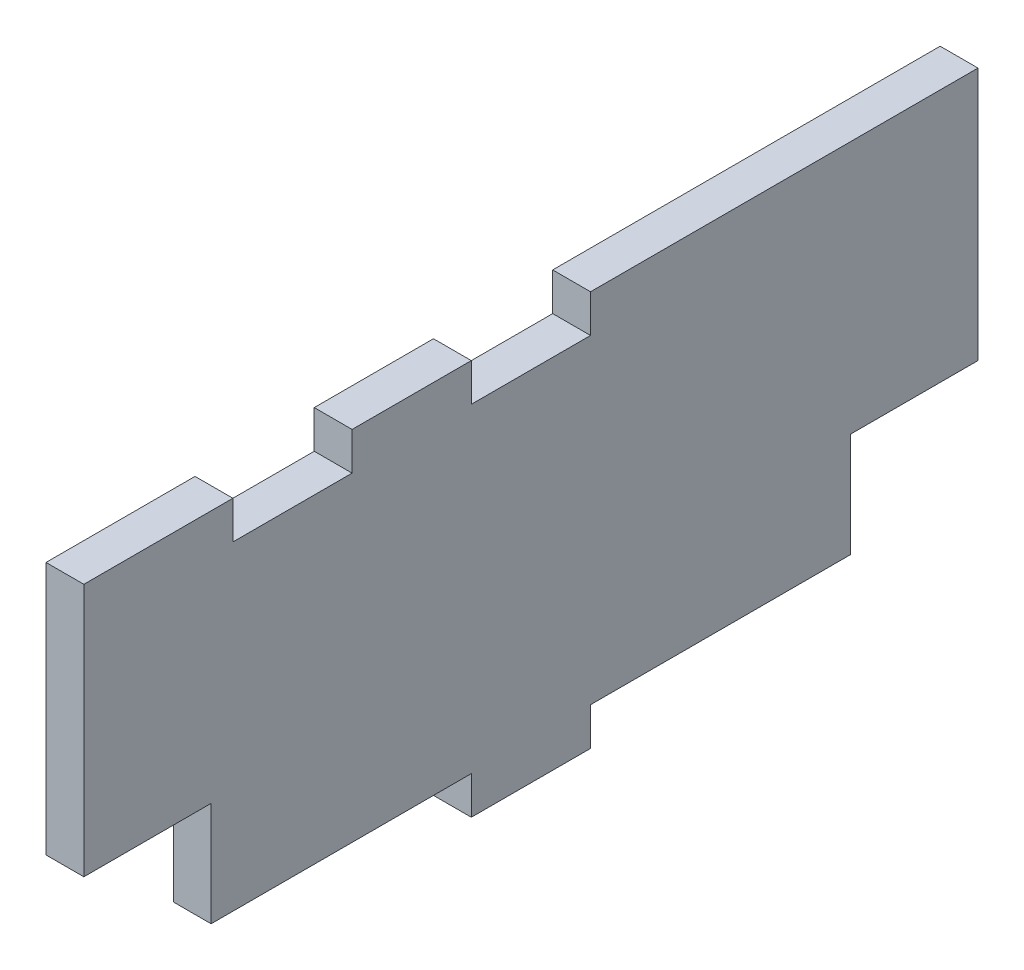
ISO-10303-21;
HEADER;
FILE_DESCRIPTION(('STEP AP214'),'2;1');
FILE_NAME('part.step','',(''),(''),'','','');
FILE_SCHEMA(('AUTOMOTIVE_DESIGN { 1 0 10303 214 1 1 1 1 }'));
ENDSEC;
DATA;
#1=APPLICATION_CONTEXT('core data for automotive mechanical design processes');
#2=APPLICATION_PROTOCOL_DEFINITION('international standard','automotive_design',2000,#1);
#3=PRODUCT_CONTEXT('',#1,'mechanical');
#4=PRODUCT('Part','Part','',(#3));
#5=PRODUCT_RELATED_PRODUCT_CATEGORY('part','',(#4));
#6=PRODUCT_DEFINITION_FORMATION('','',#4);
#7=PRODUCT_DEFINITION_CONTEXT('part definition',#1,'design');
#8=PRODUCT_DEFINITION('design','',#6,#7);
#9=PRODUCT_DEFINITION_SHAPE('','',#8);
#10=(LENGTH_UNIT() NAMED_UNIT(*) SI_UNIT(.MILLI.,.METRE.));
#11=(NAMED_UNIT(*) PLANE_ANGLE_UNIT() SI_UNIT($,.RADIAN.));
#12=(NAMED_UNIT(*) SI_UNIT($,.STERADIAN.) SOLID_ANGLE_UNIT());
#13=UNCERTAINTY_MEASURE_WITH_UNIT(LENGTH_MEASURE(1.E-05),#10,'distance_accuracy_value','');
#14=(GEOMETRIC_REPRESENTATION_CONTEXT(3) GLOBAL_UNCERTAINTY_ASSIGNED_CONTEXT((#13)) GLOBAL_UNIT_ASSIGNED_CONTEXT((#10,
#11,#12)) REPRESENTATION_CONTEXT('',''));
#15=CARTESIAN_POINT('',(0.,0.,0.));
#16=DIRECTION('',(0.,0.,1.));
#17=DIRECTION('',(1.,0.,0.));
#18=AXIS2_PLACEMENT_3D('',#15,#16,#17);
#19=CARTESIAN_POINT('',(12.7,60.,150.));
#20=DIRECTION('',(0.,1.,0.));
#21=DIRECTION('',(0.,0.,1.));
#22=AXIS2_PLACEMENT_3D('',#19,#20,#21);
#23=PLANE('',#22);
#24=DIRECTION('',(1.,0.,0.));
#25=VECTOR('',#24,1.);
#26=CARTESIAN_POINT('',(0.,60.,100.));
#27=LINE('',#26,#25);
#28=CARTESIAN_POINT('',(0.,60.,100.));
#29=VERTEX_POINT('',#28);
#30=CARTESIAN_POINT('',(12.7,60.,100.));
#31=VERTEX_POINT('',#30);
#32=EDGE_CURVE('E232',#29,#31,#27,.T.);
#33=ORIENTED_EDGE('',*,*,#32,.F.);
#34=DIRECTION('',(0.,0.,-1.));
#35=VECTOR('',#34,1.);
#36=CARTESIAN_POINT('',(0.,60.,150.));
#37=LINE('',#36,#35);
#38=CARTESIAN_POINT('',(0.,60.,150.));
#39=VERTEX_POINT('',#38);
#40=EDGE_CURVE('E223',#39,#29,#37,.T.);
#41=ORIENTED_EDGE('',*,*,#40,.F.);
#42=DIRECTION('',(-1.,0.,0.));
#43=VECTOR('',#42,1.);
#44=CARTESIAN_POINT('',(12.7,60.,150.));
#45=LINE('',#44,#43);
#46=CARTESIAN_POINT('',(12.7,60.,150.));
#47=VERTEX_POINT('',#46);
#48=EDGE_CURVE('E312',#47,#39,#45,.T.);
#49=ORIENTED_EDGE('',*,*,#48,.F.);
#50=DIRECTION('',(0.,0.,-1.));
#51=VECTOR('',#50,1.);
#52=CARTESIAN_POINT('',(12.7,60.,150.));
#53=LINE('',#52,#51);
#54=EDGE_CURVE('E309',#47,#31,#53,.T.);
#55=ORIENTED_EDGE('',*,*,#54,.T.);
#56=EDGE_LOOP('',(#33,#41,#49,#55));
#57=FACE_BOUND('',#56,.T.);
#58=ADVANCED_FACE('F63',(#57),#23,.T.);
#59=DIRECTION('',(1.,0.,0.));
#60=VECTOR('',#59,1.);
#61=CARTESIAN_POINT('',(0.,60.,60.));
#62=LINE('',#61,#60);
#63=CARTESIAN_POINT('',(0.,60.,60.));
#64=VERTEX_POINT('',#63);
#65=CARTESIAN_POINT('',(12.7,60.,60.));
#66=VERTEX_POINT('',#65);
#67=EDGE_CURVE('E234',#64,#66,#62,.T.);
#68=ORIENTED_EDGE('',*,*,#67,.T.);
#69=CARTESIAN_POINT('',(12.7,60.,20.));
#70=VERTEX_POINT('',#69);
#71=EDGE_CURVE('E313',#66,#70,#53,.T.);
#72=ORIENTED_EDGE('',*,*,#71,.T.);
#73=DIRECTION('',(1.,0.,0.));
#74=VECTOR('',#73,1.);
#75=CARTESIAN_POINT('',(0.,60.,20.));
#76=LINE('',#75,#74);
#77=CARTESIAN_POINT('',(0.,60.,20.));
#78=VERTEX_POINT('',#77);
#79=EDGE_CURVE('E254',#78,#70,#76,.T.);
#80=ORIENTED_EDGE('',*,*,#79,.F.);
#81=EDGE_CURVE('E325',#64,#78,#37,.T.);
#82=ORIENTED_EDGE('',*,*,#81,.F.);
#83=EDGE_LOOP('',(#68,#72,#80,#82));
#84=FACE_BOUND('',#83,.T.);
#85=ADVANCED_FACE('F389',(#84),#23,.T.);
#86=DIRECTION('',(1.,0.,0.));
#87=VECTOR('',#86,1.);
#88=CARTESIAN_POINT('',(0.,60.,-20.));
#89=LINE('',#88,#87);
#90=CARTESIAN_POINT('',(0.,60.,-20.));
#91=VERTEX_POINT('',#90);
#92=CARTESIAN_POINT('',(12.7,60.,-20.));
#93=VERTEX_POINT('',#92);
#94=EDGE_CURVE('E257',#91,#93,#89,.T.);
#95=ORIENTED_EDGE('',*,*,#94,.T.);
#96=CARTESIAN_POINT('',(12.7,60.,-150.));
#97=VERTEX_POINT('',#96);
#98=EDGE_CURVE('E308',#93,#97,#53,.T.);
#99=ORIENTED_EDGE('',*,*,#98,.T.);
#100=DIRECTION('',(-1.,0.,0.));
#101=VECTOR('',#100,1.);
#102=CARTESIAN_POINT('',(12.7,60.,-150.));
#103=LINE('',#102,#101);
#104=CARTESIAN_POINT('',(0.,60.,-150.));
#105=VERTEX_POINT('',#104);
#106=EDGE_CURVE('E327',#97,#105,#103,.T.);
#107=ORIENTED_EDGE('',*,*,#106,.T.);
#108=EDGE_CURVE('E323',#91,#105,#37,.T.);
#109=ORIENTED_EDGE('',*,*,#108,.F.);
#110=EDGE_LOOP('',(#95,#99,#107,#109));
#111=FACE_BOUND('',#110,.T.);
#112=ADVANCED_FACE('F399',(#111),#23,.T.);
#113=CARTESIAN_POINT('',(12.7,60.,150.));
#114=DIRECTION('',(0.,0.,-1.));
#115=DIRECTION('',(-1.,0.,0.));
#116=AXIS2_PLACEMENT_3D('',#113,#114,#115);
#117=PLANE('',#116);
#118=DIRECTION('',(0.,-1.,0.));
#119=VECTOR('',#118,1.);
#120=CARTESIAN_POINT('',(0.,60.,150.));
#121=LINE('',#120,#119);
#122=CARTESIAN_POINT('',(0.,-25.,150.));
#123=VERTEX_POINT('',#122);
#124=EDGE_CURVE('E314',#39,#123,#121,.T.);
#125=ORIENTED_EDGE('',*,*,#124,.T.);
#126=DIRECTION('',(1.,0.,0.));
#127=VECTOR('',#126,1.);
#128=CARTESIAN_POINT('',(0.,-25.,150.));
#129=LINE('',#128,#127);
#130=CARTESIAN_POINT('',(12.7,-25.,150.));
#131=VERTEX_POINT('',#130);
#132=EDGE_CURVE('E276',#123,#131,#129,.T.);
#133=ORIENTED_EDGE('',*,*,#132,.T.);
#134=DIRECTION('',(0.,-1.,0.));
#135=VECTOR('',#134,1.);
#136=CARTESIAN_POINT('',(12.7,60.,150.));
#137=LINE('',#136,#135);
#138=EDGE_CURVE('E299',#47,#131,#137,.T.);
#139=ORIENTED_EDGE('',*,*,#138,.F.);
#140=ORIENTED_EDGE('',*,*,#48,.T.);
#141=EDGE_LOOP('',(#125,#133,#139,#140));
#142=FACE_BOUND('',#141,.T.);
#143=ADVANCED_FACE('F401',(#142),#117,.F.);
#144=CARTESIAN_POINT('',(12.7,60.,-150.));
#145=DIRECTION('',(0.,0.,-1.));
#146=DIRECTION('',(-1.,0.,0.));
#147=AXIS2_PLACEMENT_3D('',#144,#145,#146);
#148=PLANE('',#147);
#149=DIRECTION('',(1.,0.,0.));
#150=VECTOR('',#149,1.);
#151=CARTESIAN_POINT('',(0.,-25.,-150.));
#152=LINE('',#151,#150);
#153=CARTESIAN_POINT('',(0.,-25.,-150.));
#154=VERTEX_POINT('',#153);
#155=CARTESIAN_POINT('',(12.7,-25.,-150.));
#156=VERTEX_POINT('',#155);
#157=EDGE_CURVE('E283',#154,#156,#152,.T.);
#158=ORIENTED_EDGE('',*,*,#157,.F.);
#159=DIRECTION('',(0.,-1.,0.));
#160=VECTOR('',#159,1.);
#161=CARTESIAN_POINT('',(0.,60.,-150.));
#162=LINE('',#161,#160);
#163=EDGE_CURVE('E320',#105,#154,#162,.T.);
#164=ORIENTED_EDGE('',*,*,#163,.F.);
#165=ORIENTED_EDGE('',*,*,#106,.F.);
#166=DIRECTION('',(0.,-1.,0.));
#167=VECTOR('',#166,1.);
#168=CARTESIAN_POINT('',(12.7,60.,-150.));
#169=LINE('',#168,#167);
#170=EDGE_CURVE('E305',#97,#156,#169,.T.);
#171=ORIENTED_EDGE('',*,*,#170,.T.);
#172=EDGE_LOOP('',(#158,#164,#165,#171));
#173=FACE_BOUND('',#172,.T.);
#174=ADVANCED_FACE('F379',(#173),#148,.T.);
#175=CARTESIAN_POINT('',(0.,0.,0.));
#176=DIRECTION('',(1.,0.,0.));
#177=DIRECTION('',(0.,0.,-1.));
#178=AXIS2_PLACEMENT_3D('',#175,#176,#177);
#179=PLANE('',#178);
#180=ORIENTED_EDGE('',*,*,#40,.T.);
#181=DIRECTION('',(0.,-1.,0.));
#182=VECTOR('',#181,1.);
#183=CARTESIAN_POINT('',(0.,60.,100.));
#184=LINE('',#183,#182);
#185=CARTESIAN_POINT('',(0.,47.3,100.));
#186=VERTEX_POINT('',#185);
#187=EDGE_CURVE('E204',#29,#186,#184,.T.);
#188=ORIENTED_EDGE('',*,*,#187,.T.);
#189=DIRECTION('',(0.,0.,-1.));
#190=VECTOR('',#189,1.);
#191=CARTESIAN_POINT('',(0.,47.3,100.));
#192=LINE('',#191,#190);
#193=CARTESIAN_POINT('',(0.,47.3,60.));
#194=VERTEX_POINT('',#193);
#195=EDGE_CURVE('E213',#186,#194,#192,.T.);
#196=ORIENTED_EDGE('',*,*,#195,.T.);
#197=DIRECTION('',(0.,1.,0.));
#198=VECTOR('',#197,1.);
#199=CARTESIAN_POINT('',(0.,60.,60.));
#200=LINE('',#199,#198);
#201=EDGE_CURVE('E210',#194,#64,#200,.T.);
#202=ORIENTED_EDGE('',*,*,#201,.T.);
#203=ORIENTED_EDGE('',*,*,#81,.T.);
#204=DIRECTION('',(0.,-1.,0.));
#205=VECTOR('',#204,1.);
#206=CARTESIAN_POINT('',(0.,60.,20.));
#207=LINE('',#206,#205);
#208=CARTESIAN_POINT('',(0.,47.3,20.));
#209=VERTEX_POINT('',#208);
#210=EDGE_CURVE('E238',#78,#209,#207,.T.);
#211=ORIENTED_EDGE('',*,*,#210,.T.);
#212=DIRECTION('',(0.,0.,-1.));
#213=VECTOR('',#212,1.);
#214=CARTESIAN_POINT('',(0.,47.3,20.));
#215=LINE('',#214,#213);
#216=CARTESIAN_POINT('',(0.,47.3,-20.));
#217=VERTEX_POINT('',#216);
#218=EDGE_CURVE('E241',#209,#217,#215,.T.);
#219=ORIENTED_EDGE('',*,*,#218,.T.);
#220=DIRECTION('',(0.,1.,0.));
#221=VECTOR('',#220,1.);
#222=CARTESIAN_POINT('',(0.,60.,-20.));
#223=LINE('',#222,#221);
#224=EDGE_CURVE('E245',#217,#91,#223,.T.);
#225=ORIENTED_EDGE('',*,*,#224,.T.);
#226=ORIENTED_EDGE('',*,*,#108,.T.);
#227=ORIENTED_EDGE('',*,*,#163,.T.);
#228=DIRECTION('',(0.,0.,1.));
#229=VECTOR('',#228,1.);
#230=CARTESIAN_POINT('',(0.,-25.,-150.));
#231=LINE('',#230,#229);
#232=CARTESIAN_POINT('',(0.,-25.,-107.3));
#233=VERTEX_POINT('',#232);
#234=EDGE_CURVE('E292',#154,#233,#231,.T.);
#235=ORIENTED_EDGE('',*,*,#234,.T.);
#236=DIRECTION('',(0.,-1.,0.));
#237=VECTOR('',#236,1.);
#238=CARTESIAN_POINT('',(0.,-25.,-107.3));
#239=LINE('',#238,#237);
#240=CARTESIAN_POINT('',(0.,-60.,-107.3));
#241=VERTEX_POINT('',#240);
#242=EDGE_CURVE('E285',#233,#241,#239,.T.);
#243=ORIENTED_EDGE('',*,*,#242,.T.);
#244=DIRECTION('',(0.,0.,-1.));
#245=VECTOR('',#244,1.);
#246=CARTESIAN_POINT('',(0.,-60.,150.));
#247=LINE('',#246,#245);
#248=CARTESIAN_POINT('',(0.,-60.,-20.));
#249=VERTEX_POINT('',#248);
#250=EDGE_CURVE('E317',#249,#241,#247,.T.);
#251=ORIENTED_EDGE('',*,*,#250,.F.);
#252=DIRECTION('',(0.,-1.,0.));
#253=VECTOR('',#252,1.);
#254=CARTESIAN_POINT('',(0.,-60.,-20.));
#255=LINE('',#254,#253);
#256=CARTESIAN_POINT('',(0.,-72.7,-20.));
#257=VERTEX_POINT('',#256);
#258=EDGE_CURVE('E334',#249,#257,#255,.T.);
#259=ORIENTED_EDGE('',*,*,#258,.T.);
#260=DIRECTION('',(0.,0.,-1.));
#261=VECTOR('',#260,1.);
#262=CARTESIAN_POINT('',(0.,-72.7,20.));
#263=LINE('',#262,#261);
#264=CARTESIAN_POINT('',(0.,-72.7,20.));
#265=VERTEX_POINT('',#264);
#266=EDGE_CURVE('E342',#265,#257,#263,.T.);
#267=ORIENTED_EDGE('',*,*,#266,.F.);
#268=DIRECTION('',(0.,-1.,0.));
#269=VECTOR('',#268,1.);
#270=CARTESIAN_POINT('',(0.,-60.,20.));
#271=LINE('',#270,#269);
#272=CARTESIAN_POINT('',(0.,-60.,20.));
#273=VERTEX_POINT('',#272);
#274=EDGE_CURVE('E279',#273,#265,#271,.T.);
#275=ORIENTED_EDGE('',*,*,#274,.F.);
#276=CARTESIAN_POINT('',(0.,-60.,107.3));
#277=VERTEX_POINT('',#276);
#278=EDGE_CURVE('E318',#277,#273,#247,.T.);
#279=ORIENTED_EDGE('',*,*,#278,.F.);
#280=DIRECTION('',(0.,1.,0.));
#281=VECTOR('',#280,1.);
#282=CARTESIAN_POINT('',(0.,-25.,107.3));
#283=LINE('',#282,#281);
#284=CARTESIAN_POINT('',(0.,-25.,107.3));
#285=VERTEX_POINT('',#284);
#286=EDGE_CURVE('E263',#277,#285,#283,.T.);
#287=ORIENTED_EDGE('',*,*,#286,.T.);
#288=DIRECTION('',(0.,0.,1.));
#289=VECTOR('',#288,1.);
#290=CARTESIAN_POINT('',(0.,-25.,150.));
#291=LINE('',#290,#289);
#292=EDGE_CURVE('E266',#285,#123,#291,.T.);
#293=ORIENTED_EDGE('',*,*,#292,.T.);
#294=ORIENTED_EDGE('',*,*,#124,.F.);
#295=EDGE_LOOP('',(#180,#188,#196,#202,#203,#211,#219,#225,#226,#227,#235,#243,#251,#259,#267,
#275,#279,#287,#293,#294));
#296=FACE_BOUND('',#295,.T.);
#297=ADVANCED_FACE('F220',(#296),#179,.F.);
#298=CARTESIAN_POINT('',(12.7,0.,0.));
#299=DIRECTION('',(1.,0.,0.));
#300=DIRECTION('',(0.,0.,-1.));
#301=AXIS2_PLACEMENT_3D('',#298,#299,#300);
#302=PLANE('',#301);
#303=DIRECTION('',(0.,-1.,0.));
#304=VECTOR('',#303,1.);
#305=CARTESIAN_POINT('',(12.7,60.,100.));
#306=LINE('',#305,#304);
#307=CARTESIAN_POINT('',(12.7,47.3,100.));
#308=VERTEX_POINT('',#307);
#309=EDGE_CURVE('E80',#31,#308,#306,.T.);
#310=ORIENTED_EDGE('',*,*,#309,.F.);
#311=ORIENTED_EDGE('',*,*,#54,.F.);
#312=ORIENTED_EDGE('',*,*,#138,.T.);
#313=DIRECTION('',(0.,0.,1.));
#314=VECTOR('',#313,1.);
#315=CARTESIAN_POINT('',(12.7,-25.,150.));
#316=LINE('',#315,#314);
#317=CARTESIAN_POINT('',(12.7,-25.,107.3));
#318=VERTEX_POINT('',#317);
#319=EDGE_CURVE('E267',#318,#131,#316,.T.);
#320=ORIENTED_EDGE('',*,*,#319,.F.);
#321=DIRECTION('',(0.,1.,0.));
#322=VECTOR('',#321,1.);
#323=CARTESIAN_POINT('',(12.7,-25.,107.3));
#324=LINE('',#323,#322);
#325=CARTESIAN_POINT('',(12.7,-60.,107.3));
#326=VERTEX_POINT('',#325);
#327=EDGE_CURVE('E271',#326,#318,#324,.T.);
#328=ORIENTED_EDGE('',*,*,#327,.F.);
#329=DIRECTION('',(0.,0.,-1.));
#330=VECTOR('',#329,1.);
#331=CARTESIAN_POINT('',(12.7,-60.,150.));
#332=LINE('',#331,#330);
#333=CARTESIAN_POINT('',(12.7,-60.,20.));
#334=VERTEX_POINT('',#333);
#335=EDGE_CURVE('E303',#326,#334,#332,.T.);
#336=ORIENTED_EDGE('',*,*,#335,.T.);
#337=DIRECTION('',(0.,-1.,0.));
#338=VECTOR('',#337,1.);
#339=CARTESIAN_POINT('',(12.7,-60.,20.));
#340=LINE('',#339,#338);
#341=CARTESIAN_POINT('',(12.7,-72.7,20.));
#342=VERTEX_POINT('',#341);
#343=EDGE_CURVE('E330',#334,#342,#340,.T.);
#344=ORIENTED_EDGE('',*,*,#343,.T.);
#345=DIRECTION('',(0.,0.,-1.));
#346=VECTOR('',#345,1.);
#347=CARTESIAN_POINT('',(12.7,-72.7,20.));
#348=LINE('',#347,#346);
#349=CARTESIAN_POINT('',(12.7,-72.7,-20.));
#350=VERTEX_POINT('',#349);
#351=EDGE_CURVE('E333',#342,#350,#348,.T.);
#352=ORIENTED_EDGE('',*,*,#351,.T.);
#353=DIRECTION('',(0.,-1.,0.));
#354=VECTOR('',#353,1.);
#355=CARTESIAN_POINT('',(12.7,-60.,-20.));
#356=LINE('',#355,#354);
#357=CARTESIAN_POINT('',(12.7,-60.,-20.));
#358=VERTEX_POINT('',#357);
#359=EDGE_CURVE('E336',#358,#350,#356,.T.);
#360=ORIENTED_EDGE('',*,*,#359,.F.);
#361=CARTESIAN_POINT('',(12.7,-60.,-107.3));
#362=VERTEX_POINT('',#361);
#363=EDGE_CURVE('E302',#358,#362,#332,.T.);
#364=ORIENTED_EDGE('',*,*,#363,.T.);
#365=DIRECTION('',(0.,-1.,0.));
#366=VECTOR('',#365,1.);
#367=CARTESIAN_POINT('',(12.7,-25.,-107.3));
#368=LINE('',#367,#366);
#369=CARTESIAN_POINT('',(12.7,-25.,-107.3));
#370=VERTEX_POINT('',#369);
#371=EDGE_CURVE('E290',#370,#362,#368,.T.);
#372=ORIENTED_EDGE('',*,*,#371,.F.);
#373=DIRECTION('',(0.,0.,1.));
#374=VECTOR('',#373,1.);
#375=CARTESIAN_POINT('',(12.7,-25.,-150.));
#376=LINE('',#375,#374);
#377=EDGE_CURVE('E274',#156,#370,#376,.T.);
#378=ORIENTED_EDGE('',*,*,#377,.F.);
#379=ORIENTED_EDGE('',*,*,#170,.F.);
#380=ORIENTED_EDGE('',*,*,#98,.F.);
#381=DIRECTION('',(0.,1.,0.));
#382=VECTOR('',#381,1.);
#383=CARTESIAN_POINT('',(12.7,60.,-20.));
#384=LINE('',#383,#382);
#385=CARTESIAN_POINT('',(12.7,47.3,-20.));
#386=VERTEX_POINT('',#385);
#387=EDGE_CURVE('E242',#386,#93,#384,.T.);
#388=ORIENTED_EDGE('',*,*,#387,.F.);
#389=DIRECTION('',(0.,0.,-1.));
#390=VECTOR('',#389,1.);
#391=CARTESIAN_POINT('',(12.7,47.3,20.));
#392=LINE('',#391,#390);
#393=CARTESIAN_POINT('',(12.7,47.3,20.));
#394=VERTEX_POINT('',#393);
#395=EDGE_CURVE('E250',#394,#386,#392,.T.);
#396=ORIENTED_EDGE('',*,*,#395,.F.);
#397=DIRECTION('',(0.,-1.,0.));
#398=VECTOR('',#397,1.);
#399=CARTESIAN_POINT('',(12.7,60.,20.));
#400=LINE('',#399,#398);
#401=EDGE_CURVE('E88',#70,#394,#400,.T.);
#402=ORIENTED_EDGE('',*,*,#401,.F.);
#403=ORIENTED_EDGE('',*,*,#71,.F.);
#404=DIRECTION('',(0.,1.,0.));
#405=VECTOR('',#404,1.);
#406=CARTESIAN_POINT('',(12.7,60.,60.));
#407=LINE('',#406,#405);
#408=CARTESIAN_POINT('',(12.7,47.3,60.));
#409=VERTEX_POINT('',#408);
#410=EDGE_CURVE('E224',#409,#66,#407,.T.);
#411=ORIENTED_EDGE('',*,*,#410,.F.);
#412=DIRECTION('',(0.,0.,-1.));
#413=VECTOR('',#412,1.);
#414=CARTESIAN_POINT('',(12.7,47.3,100.));
#415=LINE('',#414,#413);
#416=EDGE_CURVE('E226',#308,#409,#415,.T.);
#417=ORIENTED_EDGE('',*,*,#416,.F.);
#418=EDGE_LOOP('',(#310,#311,#312,#320,#328,#336,#344,#352,#360,#364,#372,#378,#379,#380,#388,
#396,#402,#403,#411,#417));
#419=FACE_BOUND('',#418,.T.);
#420=ADVANCED_FACE('F367',(#419),#302,.T.);
#421=CARTESIAN_POINT('',(12.7,-60.,150.));
#422=DIRECTION('',(0.,1.,0.));
#423=DIRECTION('',(0.,0.,1.));
#424=AXIS2_PLACEMENT_3D('',#421,#422,#423);
#425=PLANE('',#424);
#426=ORIENTED_EDGE('',*,*,#250,.T.);
#427=DIRECTION('',(1.,0.,0.));
#428=VECTOR('',#427,1.);
#429=CARTESIAN_POINT('',(0.,-60.,-107.3));
#430=LINE('',#429,#428);
#431=EDGE_CURVE('E256',#241,#362,#430,.T.);
#432=ORIENTED_EDGE('',*,*,#431,.T.);
#433=ORIENTED_EDGE('',*,*,#363,.F.);
#434=DIRECTION('',(-1.,0.,0.));
#435=VECTOR('',#434,1.);
#436=CARTESIAN_POINT('',(12.7,-60.,-20.));
#437=LINE('',#436,#435);
#438=EDGE_CURVE('E72',#358,#249,#437,.T.);
#439=ORIENTED_EDGE('',*,*,#438,.T.);
#440=EDGE_LOOP('',(#426,#432,#433,#439));
#441=FACE_BOUND('',#440,.T.);
#442=ADVANCED_FACE('F369',(#441),#425,.F.);
#443=ORIENTED_EDGE('',*,*,#335,.F.);
#444=DIRECTION('',(1.,0.,0.));
#445=VECTOR('',#444,1.);
#446=CARTESIAN_POINT('',(0.,-60.,107.3));
#447=LINE('',#446,#445);
#448=EDGE_CURVE('E270',#277,#326,#447,.T.);
#449=ORIENTED_EDGE('',*,*,#448,.F.);
#450=ORIENTED_EDGE('',*,*,#278,.T.);
#451=DIRECTION('',(-1.,0.,0.));
#452=VECTOR('',#451,1.);
#453=CARTESIAN_POINT('',(12.7,-60.,20.));
#454=LINE('',#453,#452);
#455=EDGE_CURVE('E12',#334,#273,#454,.T.);
#456=ORIENTED_EDGE('',*,*,#455,.F.);
#457=EDGE_LOOP('',(#443,#449,#450,#456));
#458=FACE_BOUND('',#457,.T.);
#459=ADVANCED_FACE('F456',(#458),#425,.F.);
#460=CARTESIAN_POINT('',(12.7,-72.7,20.));
#461=DIRECTION('',(0.,1.,0.));
#462=DIRECTION('',(0.,0.,1.));
#463=AXIS2_PLACEMENT_3D('',#460,#461,#462);
#464=PLANE('',#463);
#465=ORIENTED_EDGE('',*,*,#266,.T.);
#466=DIRECTION('',(-1.,0.,0.));
#467=VECTOR('',#466,1.);
#468=CARTESIAN_POINT('',(12.7,-72.7,-20.));
#469=LINE('',#468,#467);
#470=EDGE_CURVE('E339',#350,#257,#469,.T.);
#471=ORIENTED_EDGE('',*,*,#470,.F.);
#472=ORIENTED_EDGE('',*,*,#351,.F.);
#473=DIRECTION('',(-1.,0.,0.));
#474=VECTOR('',#473,1.);
#475=CARTESIAN_POINT('',(12.7,-72.7,20.));
#476=LINE('',#475,#474);
#477=EDGE_CURVE('E67',#342,#265,#476,.T.);
#478=ORIENTED_EDGE('',*,*,#477,.T.);
#479=EDGE_LOOP('',(#465,#471,#472,#478));
#480=FACE_BOUND('',#479,.T.);
#481=ADVANCED_FACE('F353',(#480),#464,.F.);
#482=CARTESIAN_POINT('',(12.7,-60.,-20.));
#483=DIRECTION('',(0.,0.,-1.));
#484=DIRECTION('',(-1.,0.,0.));
#485=AXIS2_PLACEMENT_3D('',#482,#483,#484);
#486=PLANE('',#485);
#487=ORIENTED_EDGE('',*,*,#258,.F.);
#488=ORIENTED_EDGE('',*,*,#438,.F.);
#489=ORIENTED_EDGE('',*,*,#359,.T.);
#490=ORIENTED_EDGE('',*,*,#470,.T.);
#491=EDGE_LOOP('',(#487,#488,#489,#490));
#492=FACE_BOUND('',#491,.T.);
#493=ADVANCED_FACE('F361',(#492),#486,.T.);
#494=CARTESIAN_POINT('',(12.7,-60.,20.));
#495=DIRECTION('',(0.,0.,-1.));
#496=DIRECTION('',(0.,1.,0.));
#497=AXIS2_PLACEMENT_3D('',#494,#495,#496);
#498=PLANE('',#497);
#499=ORIENTED_EDGE('',*,*,#274,.T.);
#500=ORIENTED_EDGE('',*,*,#477,.F.);
#501=ORIENTED_EDGE('',*,*,#343,.F.);
#502=ORIENTED_EDGE('',*,*,#455,.T.);
#503=EDGE_LOOP('',(#499,#500,#501,#502));
#504=FACE_BOUND('',#503,.T.);
#505=ADVANCED_FACE('F65',(#504),#498,.F.);
#506=CARTESIAN_POINT('',(0.,-25.,150.));
#507=DIRECTION('',(0.,1.,0.));
#508=DIRECTION('',(0.,0.,1.));
#509=AXIS2_PLACEMENT_3D('',#506,#507,#508);
#510=PLANE('',#509);
#511=ORIENTED_EDGE('',*,*,#319,.T.);
#512=ORIENTED_EDGE('',*,*,#132,.F.);
#513=ORIENTED_EDGE('',*,*,#292,.F.);
#514=DIRECTION('',(1.,0.,0.));
#515=VECTOR('',#514,1.);
#516=CARTESIAN_POINT('',(0.,-25.,107.3));
#517=LINE('',#516,#515);
#518=EDGE_CURVE('E280',#285,#318,#517,.T.);
#519=ORIENTED_EDGE('',*,*,#518,.T.);
#520=EDGE_LOOP('',(#511,#512,#513,#519));
#521=FACE_BOUND('',#520,.T.);
#522=ADVANCED_FACE('F436',(#521),#510,.F.);
#523=CARTESIAN_POINT('',(0.,-25.,107.3));
#524=DIRECTION('',(0.,0.,-1.));
#525=DIRECTION('',(0.,1.,0.));
#526=AXIS2_PLACEMENT_3D('',#523,#524,#525);
#527=PLANE('',#526);
#528=ORIENTED_EDGE('',*,*,#327,.T.);
#529=ORIENTED_EDGE('',*,*,#518,.F.);
#530=ORIENTED_EDGE('',*,*,#286,.F.);
#531=ORIENTED_EDGE('',*,*,#448,.T.);
#532=EDGE_LOOP('',(#528,#529,#530,#531));
#533=FACE_BOUND('',#532,.T.);
#534=ADVANCED_FACE('F439',(#533),#527,.F.);
#535=CARTESIAN_POINT('',(0.,-25.,-107.3));
#536=DIRECTION('',(0.,0.,1.));
#537=DIRECTION('',(1.,0.,0.));
#538=AXIS2_PLACEMENT_3D('',#535,#536,#537);
#539=PLANE('',#538);
#540=ORIENTED_EDGE('',*,*,#371,.T.);
#541=ORIENTED_EDGE('',*,*,#431,.F.);
#542=ORIENTED_EDGE('',*,*,#242,.F.);
#543=DIRECTION('',(1.,0.,0.));
#544=VECTOR('',#543,1.);
#545=CARTESIAN_POINT('',(0.,-25.,-107.3));
#546=LINE('',#545,#544);
#547=EDGE_CURVE('E286',#233,#370,#546,.T.);
#548=ORIENTED_EDGE('',*,*,#547,.T.);
#549=EDGE_LOOP('',(#540,#541,#542,#548));
#550=FACE_BOUND('',#549,.T.);
#551=ADVANCED_FACE('F372',(#550),#539,.F.);
#552=CARTESIAN_POINT('',(0.,-25.,-150.));
#553=DIRECTION('',(0.,1.,0.));
#554=DIRECTION('',(0.,0.,1.));
#555=AXIS2_PLACEMENT_3D('',#552,#553,#554);
#556=PLANE('',#555);
#557=ORIENTED_EDGE('',*,*,#377,.T.);
#558=ORIENTED_EDGE('',*,*,#547,.F.);
#559=ORIENTED_EDGE('',*,*,#234,.F.);
#560=ORIENTED_EDGE('',*,*,#157,.T.);
#561=EDGE_LOOP('',(#557,#558,#559,#560));
#562=FACE_BOUND('',#561,.T.);
#563=ADVANCED_FACE('F376',(#562),#556,.F.);
#564=CARTESIAN_POINT('',(0.,60.,20.));
#565=DIRECTION('',(0.,0.,1.));
#566=DIRECTION('',(1.,0.,0.));
#567=AXIS2_PLACEMENT_3D('',#564,#565,#566);
#568=PLANE('',#567);
#569=ORIENTED_EDGE('',*,*,#401,.T.);
#570=DIRECTION('',(1.,0.,0.));
#571=VECTOR('',#570,1.);
#572=CARTESIAN_POINT('',(0.,47.3,20.));
#573=LINE('',#572,#571);
#574=EDGE_CURVE('E248',#209,#394,#573,.T.);
#575=ORIENTED_EDGE('',*,*,#574,.F.);
#576=ORIENTED_EDGE('',*,*,#210,.F.);
#577=ORIENTED_EDGE('',*,*,#79,.T.);
#578=EDGE_LOOP('',(#569,#575,#576,#577));
#579=FACE_BOUND('',#578,.T.);
#580=ADVANCED_FACE('F393',(#579),#568,.F.);
#581=CARTESIAN_POINT('',(0.,60.,-20.));
#582=DIRECTION('',(0.,0.,-1.));
#583=DIRECTION('',(0.,1.,0.));
#584=AXIS2_PLACEMENT_3D('',#581,#582,#583);
#585=PLANE('',#584);
#586=ORIENTED_EDGE('',*,*,#387,.T.);
#587=ORIENTED_EDGE('',*,*,#94,.F.);
#588=ORIENTED_EDGE('',*,*,#224,.F.);
#589=DIRECTION('',(1.,0.,0.));
#590=VECTOR('',#589,1.);
#591=CARTESIAN_POINT('',(0.,47.3,-20.));
#592=LINE('',#591,#590);
#593=EDGE_CURVE('E260',#217,#386,#592,.T.);
#594=ORIENTED_EDGE('',*,*,#593,.T.);
#595=EDGE_LOOP('',(#586,#587,#588,#594));
#596=FACE_BOUND('',#595,.T.);
#597=ADVANCED_FACE('F430',(#596),#585,.F.);
#598=CARTESIAN_POINT('',(0.,47.3,20.));
#599=DIRECTION('',(0.,-1.,0.));
#600=DIRECTION('',(0.,0.,-1.));
#601=AXIS2_PLACEMENT_3D('',#598,#599,#600);
#602=PLANE('',#601);
#603=ORIENTED_EDGE('',*,*,#395,.T.);
#604=ORIENTED_EDGE('',*,*,#593,.F.);
#605=ORIENTED_EDGE('',*,*,#218,.F.);
#606=ORIENTED_EDGE('',*,*,#574,.T.);
#607=EDGE_LOOP('',(#603,#604,#605,#606));
#608=FACE_BOUND('',#607,.T.);
#609=ADVANCED_FACE('F395',(#608),#602,.F.);
#610=CARTESIAN_POINT('',(0.,60.,100.));
#611=DIRECTION('',(0.,0.,1.));
#612=DIRECTION('',(0.,-1.,0.));
#613=AXIS2_PLACEMENT_3D('',#610,#611,#612);
#614=PLANE('',#613);
#615=ORIENTED_EDGE('',*,*,#309,.T.);
#616=DIRECTION('',(1.,0.,0.));
#617=VECTOR('',#616,1.);
#618=CARTESIAN_POINT('',(0.,47.3,100.));
#619=LINE('',#618,#617);
#620=EDGE_CURVE('E200',#186,#308,#619,.T.);
#621=ORIENTED_EDGE('',*,*,#620,.F.);
#622=ORIENTED_EDGE('',*,*,#187,.F.);
#623=ORIENTED_EDGE('',*,*,#32,.T.);
#624=EDGE_LOOP('',(#615,#621,#622,#623));
#625=FACE_BOUND('',#624,.T.);
#626=ADVANCED_FACE('F202',(#625),#614,.F.);
#627=CARTESIAN_POINT('',(0.,60.,60.));
#628=DIRECTION('',(0.,0.,-1.));
#629=DIRECTION('',(-1.,0.,0.));
#630=AXIS2_PLACEMENT_3D('',#627,#628,#629);
#631=PLANE('',#630);
#632=ORIENTED_EDGE('',*,*,#410,.T.);
#633=ORIENTED_EDGE('',*,*,#67,.F.);
#634=ORIENTED_EDGE('',*,*,#201,.F.);
#635=DIRECTION('',(1.,0.,0.));
#636=VECTOR('',#635,1.);
#637=CARTESIAN_POINT('',(0.,47.3,60.));
#638=LINE('',#637,#636);
#639=EDGE_CURVE('E209',#194,#409,#638,.T.);
#640=ORIENTED_EDGE('',*,*,#639,.T.);
#641=EDGE_LOOP('',(#632,#633,#634,#640));
#642=FACE_BOUND('',#641,.T.);
#643=ADVANCED_FACE('F420',(#642),#631,.F.);
#644=CARTESIAN_POINT('',(0.,47.3,100.));
#645=DIRECTION('',(0.,-1.,0.));
#646=DIRECTION('',(0.,0.,-1.));
#647=AXIS2_PLACEMENT_3D('',#644,#645,#646);
#648=PLANE('',#647);
#649=ORIENTED_EDGE('',*,*,#416,.T.);
#650=ORIENTED_EDGE('',*,*,#639,.F.);
#651=ORIENTED_EDGE('',*,*,#195,.F.);
#652=ORIENTED_EDGE('',*,*,#620,.T.);
#653=EDGE_LOOP('',(#649,#650,#651,#652));
#654=FACE_BOUND('',#653,.T.);
#655=ADVANCED_FACE('F214',(#654),#648,.F.);
#656=CLOSED_SHELL('',(#58,#85,#112,#143,#174,#297,#420,#442,#459,#481,#493,#505,#522,#534,#551,
#563,#580,#597,#609,#626,#643,#655));
#657=MANIFOLD_SOLID_BREP('B2',#656);
#658=ADVANCED_BREP_SHAPE_REPRESENTATION('',(#18,#657),#14);
#659=SHAPE_DEFINITION_REPRESENTATION(#9,#658);
ENDSEC;
END-ISO-10303-21;
